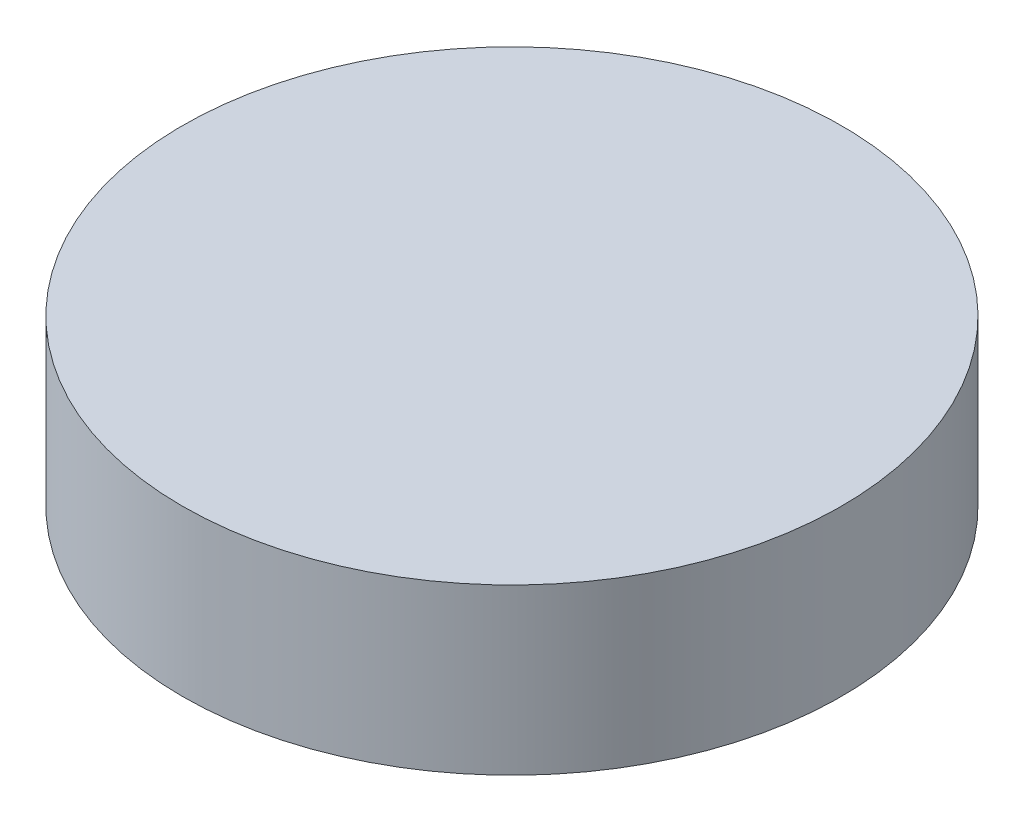
ISO-10303-21;
HEADER;
FILE_DESCRIPTION(('STEP AP214'),'2;1');
FILE_NAME('part.step','',(''),(''),'','','');
FILE_SCHEMA(('AUTOMOTIVE_DESIGN { 1 0 10303 214 1 1 1 1 }'));
ENDSEC;
DATA;
#1=APPLICATION_CONTEXT('core data for automotive mechanical design processes');
#2=APPLICATION_PROTOCOL_DEFINITION('international standard','automotive_design',2000,#1);
#3=PRODUCT_CONTEXT('',#1,'mechanical');
#4=PRODUCT('Part','Part','',(#3));
#5=PRODUCT_RELATED_PRODUCT_CATEGORY('part','',(#4));
#6=PRODUCT_DEFINITION_FORMATION('','',#4);
#7=PRODUCT_DEFINITION_CONTEXT('part definition',#1,'design');
#8=PRODUCT_DEFINITION('design','',#6,#7);
#9=PRODUCT_DEFINITION_SHAPE('','',#8);
#10=(LENGTH_UNIT() NAMED_UNIT(*) SI_UNIT(.MILLI.,.METRE.));
#11=(NAMED_UNIT(*) PLANE_ANGLE_UNIT() SI_UNIT($,.RADIAN.));
#12=(NAMED_UNIT(*) SI_UNIT($,.STERADIAN.) SOLID_ANGLE_UNIT());
#13=UNCERTAINTY_MEASURE_WITH_UNIT(LENGTH_MEASURE(1.E-05),#10,'distance_accuracy_value','');
#14=(GEOMETRIC_REPRESENTATION_CONTEXT(3) GLOBAL_UNCERTAINTY_ASSIGNED_CONTEXT((#13)) GLOBAL_UNIT_ASSIGNED_CONTEXT((#10,
#11,#12)) REPRESENTATION_CONTEXT('',''));
#15=CARTESIAN_POINT('',(0.,0.,0.));
#16=DIRECTION('',(0.,0.,1.));
#17=DIRECTION('',(1.,0.,0.));
#18=AXIS2_PLACEMENT_3D('',#15,#16,#17);
#19=CARTESIAN_POINT('',(0.,63.5,0.));
#20=DIRECTION('',(0.,-1.,0.));
#21=DIRECTION('',(0.,0.,-1.));
#22=AXIS2_PLACEMENT_3D('',#19,#20,#21);
#23=CYLINDRICAL_SURFACE('',#22,127.);
#24=CARTESIAN_POINT('',(0.,63.5,0.));
#25=DIRECTION('',(0.,1.,0.));
#26=DIRECTION('',(0.,0.,1.));
#27=AXIS2_PLACEMENT_3D('',#24,#25,#26);
#28=CIRCLE('',#27,127.);
#29=CARTESIAN_POINT('',(0.,63.5,127.));
#30=VERTEX_POINT('',#29);
#31=EDGE_CURVE('E10',#30,#30,#28,.T.);
#32=ORIENTED_EDGE('',*,*,#31,.F.);
#33=EDGE_LOOP('',(#32));
#34=FACE_BOUND('',#33,.T.);
#35=CARTESIAN_POINT('',(0.,0.,0.));
#36=DIRECTION('',(0.,1.,0.));
#37=DIRECTION('',(0.,0.,1.));
#38=AXIS2_PLACEMENT_3D('',#35,#36,#37);
#39=CIRCLE('',#38,127.);
#40=CARTESIAN_POINT('',(0.,0.,127.));
#41=VERTEX_POINT('',#40);
#42=EDGE_CURVE('E34',#41,#41,#39,.T.);
#43=ORIENTED_EDGE('',*,*,#42,.T.);
#44=EDGE_LOOP('',(#43));
#45=FACE_BOUND('',#44,.T.);
#46=ADVANCED_FACE('F31',(#34,#45),#23,.T.);
#47=CARTESIAN_POINT('',(0.,63.5,0.));
#48=DIRECTION('',(0.,1.,0.));
#49=DIRECTION('',(0.,0.,1.));
#50=AXIS2_PLACEMENT_3D('',#47,#48,#49);
#51=PLANE('',#50);
#52=ORIENTED_EDGE('',*,*,#31,.T.);
#53=EDGE_LOOP('',(#52));
#54=FACE_BOUND('',#53,.T.);
#55=ADVANCED_FACE('F46',(#54),#51,.T.);
#56=CARTESIAN_POINT('',(0.,0.,0.));
#57=DIRECTION('',(0.,1.,0.));
#58=DIRECTION('',(0.,0.,1.));
#59=AXIS2_PLACEMENT_3D('',#56,#57,#58);
#60=PLANE('',#59);
#61=ORIENTED_EDGE('',*,*,#42,.F.);
#62=EDGE_LOOP('',(#61));
#63=FACE_BOUND('',#62,.T.);
#64=ADVANCED_FACE('F44',(#63),#60,.F.);
#65=CLOSED_SHELL('',(#46,#55,#64));
#66=MANIFOLD_SOLID_BREP('B2',#65);
#67=ADVANCED_BREP_SHAPE_REPRESENTATION('',(#18,#66),#14);
#68=SHAPE_DEFINITION_REPRESENTATION(#9,#67);
ENDSEC;
END-ISO-10303-21;
